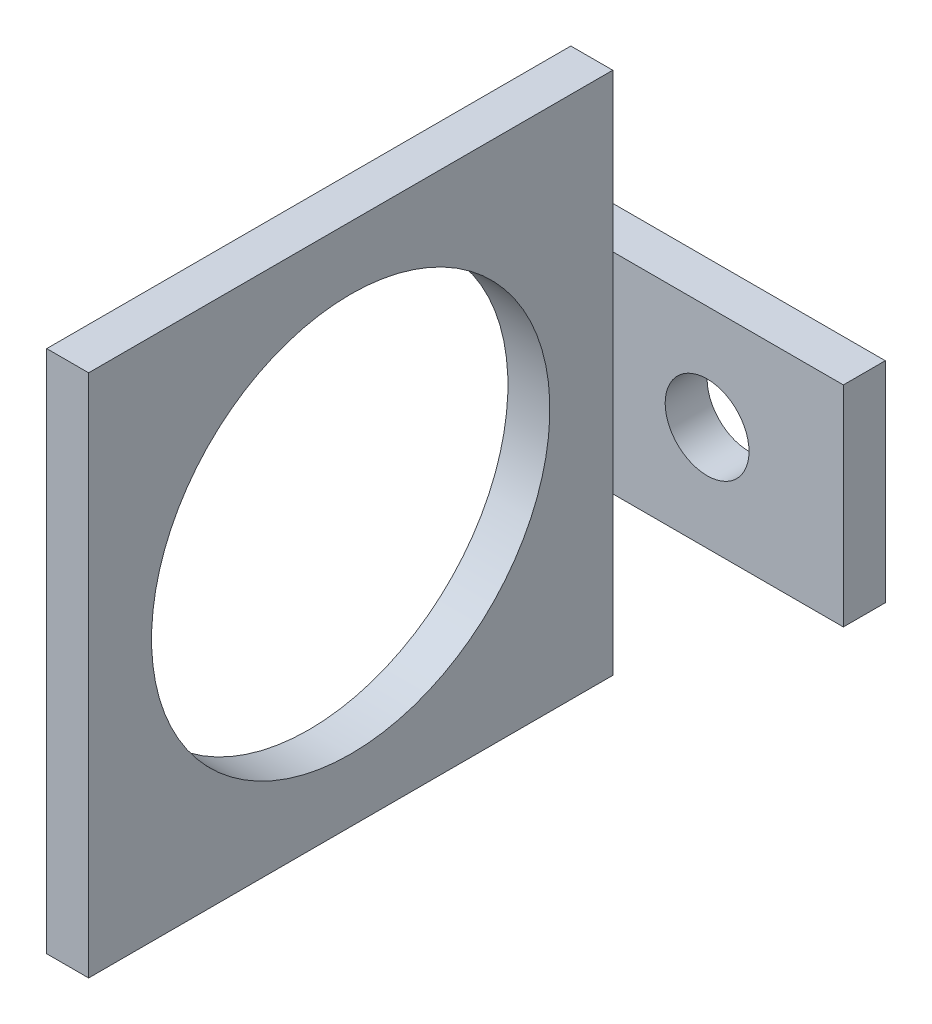
ISO-10303-21;
HEADER;
FILE_DESCRIPTION(('STEP AP214'),'2;1');
FILE_NAME('part.step','',(''),(''),'','','');
FILE_SCHEMA(('AUTOMOTIVE_DESIGN { 1 0 10303 214 1 1 1 1 }'));
ENDSEC;
DATA;
#1=APPLICATION_CONTEXT('core data for automotive mechanical design processes');
#2=APPLICATION_PROTOCOL_DEFINITION('international standard','automotive_design',2000,#1);
#3=PRODUCT_CONTEXT('',#1,'mechanical');
#4=PRODUCT('Part','Part','',(#3));
#5=PRODUCT_RELATED_PRODUCT_CATEGORY('part','',(#4));
#6=PRODUCT_DEFINITION_FORMATION('','',#4);
#7=PRODUCT_DEFINITION_CONTEXT('part definition',#1,'design');
#8=PRODUCT_DEFINITION('design','',#6,#7);
#9=PRODUCT_DEFINITION_SHAPE('','',#8);
#10=(LENGTH_UNIT() NAMED_UNIT(*) SI_UNIT(.MILLI.,.METRE.));
#11=(NAMED_UNIT(*) PLANE_ANGLE_UNIT() SI_UNIT($,.RADIAN.));
#12=(NAMED_UNIT(*) SI_UNIT($,.STERADIAN.) SOLID_ANGLE_UNIT());
#13=UNCERTAINTY_MEASURE_WITH_UNIT(LENGTH_MEASURE(1.E-05),#10,'distance_accuracy_value','');
#14=(GEOMETRIC_REPRESENTATION_CONTEXT(3) GLOBAL_UNCERTAINTY_ASSIGNED_CONTEXT((#13)) GLOBAL_UNIT_ASSIGNED_CONTEXT((#10,
#11,#12)) REPRESENTATION_CONTEXT('',''));
#15=CARTESIAN_POINT('',(0.,0.,0.));
#16=DIRECTION('',(0.,0.,1.));
#17=DIRECTION('',(1.,0.,0.));
#18=AXIS2_PLACEMENT_3D('',#15,#16,#17);
#19=CARTESIAN_POINT('',(-6.5,-5.,2.));
#20=DIRECTION('',(0.,1.,0.));
#21=DIRECTION('',(0.,0.,1.));
#22=AXIS2_PLACEMENT_3D('',#19,#20,#21);
#23=PLANE('',#22);
#24=DIRECTION('',(1.,0.,0.));
#25=VECTOR('',#24,1.);
#26=CARTESIAN_POINT('',(-6.49999999999999,-5.,2.));
#27=LINE('',#26,#25);
#28=CARTESIAN_POINT('',(-6.5,-5.,2.));
#29=VERTEX_POINT('',#28);
#30=CARTESIAN_POINT('',(-4.5,-5.,2.));
#31=VERTEX_POINT('',#30);
#32=EDGE_CURVE('E51',#29,#31,#27,.T.);
#33=ORIENTED_EDGE('',*,*,#32,.F.);
#34=DIRECTION('',(0.,0.,-1.));
#35=VECTOR('',#34,1.);
#36=CARTESIAN_POINT('',(-6.5,-5.,2.));
#37=LINE('',#36,#35);
#38=CARTESIAN_POINT('',(-6.5,-5.,0.));
#39=VERTEX_POINT('',#38);
#40=EDGE_CURVE('E80',#29,#39,#37,.T.);
#41=ORIENTED_EDGE('',*,*,#40,.T.);
#42=DIRECTION('',(1.,0.,0.));
#43=VECTOR('',#42,1.);
#44=CARTESIAN_POINT('',(-6.5,-5.,0.));
#45=LINE('',#44,#43);
#46=CARTESIAN_POINT('',(6.5,-5.,0.));
#47=VERTEX_POINT('',#46);
#48=EDGE_CURVE('E76',#39,#47,#45,.T.);
#49=ORIENTED_EDGE('',*,*,#48,.T.);
#50=DIRECTION('',(0.,0.,-1.));
#51=VECTOR('',#50,1.);
#52=CARTESIAN_POINT('',(6.5,-5.,2.));
#53=LINE('',#52,#51);
#54=CARTESIAN_POINT('',(6.5,-5.,2.));
#55=VERTEX_POINT('',#54);
#56=EDGE_CURVE('E78',#55,#47,#53,.T.);
#57=ORIENTED_EDGE('',*,*,#56,.F.);
#58=DIRECTION('',(1.,0.,0.));
#59=VECTOR('',#58,1.);
#60=CARTESIAN_POINT('',(-6.5,-5.,2.));
#61=LINE('',#60,#59);
#62=EDGE_CURVE('E59',#31,#55,#61,.T.);
#63=ORIENTED_EDGE('',*,*,#62,.F.);
#64=EDGE_LOOP('',(#33,#41,#49,#57,#63));
#65=FACE_BOUND('',#64,.T.);
#66=ADVANCED_FACE('F36',(#65),#23,.F.);
#67=CARTESIAN_POINT('',(-6.5,5.,2.));
#68=DIRECTION('',(0.,-1.,0.));
#69=DIRECTION('',(0.,0.,-1.));
#70=AXIS2_PLACEMENT_3D('',#67,#68,#69);
#71=PLANE('',#70);
#72=DIRECTION('',(-1.,0.,0.));
#73=VECTOR('',#72,1.);
#74=CARTESIAN_POINT('',(-6.5,5.,2.));
#75=LINE('',#74,#73);
#76=CARTESIAN_POINT('',(-4.5,5.,2.));
#77=VERTEX_POINT('',#76);
#78=CARTESIAN_POINT('',(-6.5,5.,2.));
#79=VERTEX_POINT('',#78);
#80=EDGE_CURVE('E120',#77,#79,#75,.T.);
#81=ORIENTED_EDGE('',*,*,#80,.F.);
#82=DIRECTION('',(-1.,0.,0.));
#83=VECTOR('',#82,1.);
#84=CARTESIAN_POINT('',(-6.5,5.,2.));
#85=LINE('',#84,#83);
#86=CARTESIAN_POINT('',(6.5,5.,2.));
#87=VERTEX_POINT('',#86);
#88=EDGE_CURVE('E119',#87,#77,#85,.T.);
#89=ORIENTED_EDGE('',*,*,#88,.F.);
#90=DIRECTION('',(0.,0.,-1.));
#91=VECTOR('',#90,1.);
#92=CARTESIAN_POINT('',(6.5,5.,2.));
#93=LINE('',#92,#91);
#94=CARTESIAN_POINT('',(6.5,5.,0.));
#95=VERTEX_POINT('',#94);
#96=EDGE_CURVE('E11',#87,#95,#93,.T.);
#97=ORIENTED_EDGE('',*,*,#96,.T.);
#98=DIRECTION('',(-1.,0.,0.));
#99=VECTOR('',#98,1.);
#100=CARTESIAN_POINT('',(-6.5,5.,0.));
#101=LINE('',#100,#99);
#102=CARTESIAN_POINT('',(-6.5,5.,0.));
#103=VERTEX_POINT('',#102);
#104=EDGE_CURVE('E95',#95,#103,#101,.T.);
#105=ORIENTED_EDGE('',*,*,#104,.T.);
#106=DIRECTION('',(0.,0.,-1.));
#107=VECTOR('',#106,1.);
#108=CARTESIAN_POINT('',(-6.5,5.,2.));
#109=LINE('',#108,#107);
#110=EDGE_CURVE('E44',#79,#103,#109,.T.);
#111=ORIENTED_EDGE('',*,*,#110,.F.);
#112=EDGE_LOOP('',(#81,#89,#97,#105,#111));
#113=FACE_BOUND('',#112,.T.);
#114=ADVANCED_FACE('F117',(#113),#71,.F.);
#115=CARTESIAN_POINT('',(6.5,5.,2.));
#116=DIRECTION('',(-1.,0.,0.));
#117=DIRECTION('',(0.,-1.,0.));
#118=AXIS2_PLACEMENT_3D('',#115,#116,#117);
#119=PLANE('',#118);
#120=DIRECTION('',(0.,1.,0.));
#121=VECTOR('',#120,1.);
#122=CARTESIAN_POINT('',(6.5,5.,0.));
#123=LINE('',#122,#121);
#124=EDGE_CURVE('E91',#47,#95,#123,.T.);
#125=ORIENTED_EDGE('',*,*,#124,.T.);
#126=ORIENTED_EDGE('',*,*,#96,.F.);
#127=DIRECTION('',(0.,1.,0.));
#128=VECTOR('',#127,1.);
#129=CARTESIAN_POINT('',(6.5,5.,2.));
#130=LINE('',#129,#128);
#131=EDGE_CURVE('E85',#55,#87,#130,.T.);
#132=ORIENTED_EDGE('',*,*,#131,.F.);
#133=ORIENTED_EDGE('',*,*,#56,.T.);
#134=EDGE_LOOP('',(#125,#126,#132,#133));
#135=FACE_BOUND('',#134,.T.);
#136=ADVANCED_FACE('F38',(#135),#119,.F.);
#137=CARTESIAN_POINT('',(-6.5,5.,2.));
#138=DIRECTION('',(1.,0.,0.));
#139=DIRECTION('',(0.,0.,-1.));
#140=AXIS2_PLACEMENT_3D('',#137,#138,#139);
#141=PLANE('',#140);
#142=CARTESIAN_POINT('',(-6.5,0.,14.5));
#143=DIRECTION('',(1.,0.,0.));
#144=DIRECTION('',(0.,1.,0.));
#145=AXIS2_PLACEMENT_3D('',#142,#143,#144);
#146=CIRCLE('',#145,9.5);
#147=CARTESIAN_POINT('',(-6.5,9.5,14.5));
#148=VERTEX_POINT('',#147);
#149=EDGE_CURVE('E171',#148,#148,#146,.T.);
#150=ORIENTED_EDGE('',*,*,#149,.T.);
#151=EDGE_LOOP('',(#150));
#152=FACE_BOUND('',#151,.T.);
#153=DIRECTION('',(0.,-1.,0.));
#154=VECTOR('',#153,1.);
#155=CARTESIAN_POINT('',(-6.5,5.,0.));
#156=LINE('',#155,#154);
#157=EDGE_CURVE('E86',#103,#39,#156,.T.);
#158=ORIENTED_EDGE('',*,*,#157,.T.);
#159=ORIENTED_EDGE('',*,*,#40,.F.);
#160=DIRECTION('',(0.,1.,0.));
#161=VECTOR('',#160,1.);
#162=CARTESIAN_POINT('',(-6.49999999999999,-12.5,2.));
#163=LINE('',#162,#161);
#164=CARTESIAN_POINT('',(-6.49999999999999,-12.5,2.));
#165=VERTEX_POINT('',#164);
#166=EDGE_CURVE('E136',#165,#29,#163,.T.);
#167=ORIENTED_EDGE('',*,*,#166,.F.);
#168=DIRECTION('',(0.,0.,-1.));
#169=VECTOR('',#168,1.);
#170=CARTESIAN_POINT('',(-6.5,-12.5,27.));
#171=LINE('',#170,#169);
#172=CARTESIAN_POINT('',(-6.5,-12.5,27.));
#173=VERTEX_POINT('',#172);
#174=EDGE_CURVE('E154',#173,#165,#171,.T.);
#175=ORIENTED_EDGE('',*,*,#174,.F.);
#176=DIRECTION('',(0.,-1.,0.));
#177=VECTOR('',#176,1.);
#178=CARTESIAN_POINT('',(-6.5,5.,27.));
#179=LINE('',#178,#177);
#180=CARTESIAN_POINT('',(-6.5,12.5,27.));
#181=VERTEX_POINT('',#180);
#182=EDGE_CURVE('E100',#181,#173,#179,.T.);
#183=ORIENTED_EDGE('',*,*,#182,.F.);
#184=DIRECTION('',(0.,0.,1.));
#185=VECTOR('',#184,1.);
#186=CARTESIAN_POINT('',(-6.5,12.5,27.));
#187=LINE('',#186,#185);
#188=CARTESIAN_POINT('',(-6.5,12.5,2.));
#189=VERTEX_POINT('',#188);
#190=EDGE_CURVE('E135',#189,#181,#187,.T.);
#191=ORIENTED_EDGE('',*,*,#190,.F.);
#192=DIRECTION('',(0.,-1.,0.));
#193=VECTOR('',#192,1.);
#194=CARTESIAN_POINT('',(-6.5,12.5,2.));
#195=LINE('',#194,#193);
#196=EDGE_CURVE('E113',#189,#79,#195,.T.);
#197=ORIENTED_EDGE('',*,*,#196,.T.);
#198=ORIENTED_EDGE('',*,*,#110,.T.);
#199=EDGE_LOOP('',(#158,#159,#167,#175,#183,#191,#197,#198));
#200=FACE_BOUND('',#199,.T.);
#201=ADVANCED_FACE('F109',(#152,#200),#141,.F.);
#202=CARTESIAN_POINT('',(0.,0.,2.));
#203=DIRECTION('',(0.,0.,1.));
#204=DIRECTION('',(1.,0.,0.));
#205=AXIS2_PLACEMENT_3D('',#202,#203,#204);
#206=PLANE('',#205);
#207=CARTESIAN_POINT('',(0.,0.,2.));
#208=DIRECTION('',(0.,0.,1.));
#209=DIRECTION('',(1.,0.,0.));
#210=AXIS2_PLACEMENT_3D('',#207,#208,#209);
#211=CIRCLE('',#210,2.);
#212=CARTESIAN_POINT('',(2.,0.,2.));
#213=VERTEX_POINT('',#212);
#214=EDGE_CURVE('E155',#213,#213,#211,.T.);
#215=ORIENTED_EDGE('',*,*,#214,.F.);
#216=EDGE_LOOP('',(#215));
#217=FACE_BOUND('',#216,.T.);
#218=DIRECTION('',(0.,1.,0.));
#219=VECTOR('',#218,1.);
#220=CARTESIAN_POINT('',(-4.5,5.,2.));
#221=LINE('',#220,#219);
#222=EDGE_CURVE('E125',#31,#77,#221,.T.);
#223=ORIENTED_EDGE('',*,*,#222,.F.);
#224=ORIENTED_EDGE('',*,*,#62,.T.);
#225=ORIENTED_EDGE('',*,*,#131,.T.);
#226=ORIENTED_EDGE('',*,*,#88,.T.);
#227=EDGE_LOOP('',(#223,#224,#225,#226));
#228=FACE_BOUND('',#227,.T.);
#229=ADVANCED_FACE('F122',(#217,#228),#206,.T.);
#230=CARTESIAN_POINT('',(0.,0.,0.));
#231=DIRECTION('',(0.,0.,1.));
#232=DIRECTION('',(1.,0.,0.));
#233=AXIS2_PLACEMENT_3D('',#230,#231,#232);
#234=PLANE('',#233);
#235=CARTESIAN_POINT('',(0.,0.,0.));
#236=DIRECTION('',(0.,0.,-1.));
#237=DIRECTION('',(-1.,0.,0.));
#238=AXIS2_PLACEMENT_3D('',#235,#236,#237);
#239=CIRCLE('',#238,2.);
#240=CARTESIAN_POINT('',(-2.,0.,0.));
#241=VERTEX_POINT('',#240);
#242=EDGE_CURVE('E168',#241,#241,#239,.T.);
#243=ORIENTED_EDGE('',*,*,#242,.F.);
#244=EDGE_LOOP('',(#243));
#245=FACE_BOUND('',#244,.T.);
#246=ORIENTED_EDGE('',*,*,#124,.F.);
#247=ORIENTED_EDGE('',*,*,#48,.F.);
#248=ORIENTED_EDGE('',*,*,#157,.F.);
#249=ORIENTED_EDGE('',*,*,#104,.F.);
#250=EDGE_LOOP('',(#246,#247,#248,#249));
#251=FACE_BOUND('',#250,.T.);
#252=ADVANCED_FACE('F93',(#245,#251),#234,.F.);
#253=CARTESIAN_POINT('',(-4.5,5.,27.));
#254=DIRECTION('',(-1.,0.,0.));
#255=DIRECTION('',(0.,-1.,0.));
#256=AXIS2_PLACEMENT_3D('',#253,#254,#255);
#257=PLANE('',#256);
#258=CARTESIAN_POINT('',(-4.5,0.,14.5));
#259=DIRECTION('',(1.,0.,0.));
#260=DIRECTION('',(0.,1.,0.));
#261=AXIS2_PLACEMENT_3D('',#258,#259,#260);
#262=CIRCLE('',#261,9.5);
#263=CARTESIAN_POINT('',(-4.5,9.5,14.5));
#264=VERTEX_POINT('',#263);
#265=EDGE_CURVE('E172',#264,#264,#262,.T.);
#266=ORIENTED_EDGE('',*,*,#265,.F.);
#267=EDGE_LOOP('',(#266));
#268=FACE_BOUND('',#267,.T.);
#269=ORIENTED_EDGE('',*,*,#222,.T.);
#270=DIRECTION('',(0.,-1.,0.));
#271=VECTOR('',#270,1.);
#272=CARTESIAN_POINT('',(-4.5,12.5,2.));
#273=LINE('',#272,#271);
#274=CARTESIAN_POINT('',(-4.5,12.5,2.));
#275=VERTEX_POINT('',#274);
#276=EDGE_CURVE('E126',#275,#77,#273,.T.);
#277=ORIENTED_EDGE('',*,*,#276,.F.);
#278=DIRECTION('',(0.,0.,-1.));
#279=VECTOR('',#278,1.);
#280=CARTESIAN_POINT('',(-4.5,12.5,27.));
#281=LINE('',#280,#279);
#282=CARTESIAN_POINT('',(-4.5,12.5,27.));
#283=VERTEX_POINT('',#282);
#284=EDGE_CURVE('E139',#283,#275,#281,.T.);
#285=ORIENTED_EDGE('',*,*,#284,.F.);
#286=DIRECTION('',(0.,1.,0.));
#287=VECTOR('',#286,1.);
#288=CARTESIAN_POINT('',(-4.5,5.,27.));
#289=LINE('',#288,#287);
#290=CARTESIAN_POINT('',(-4.5,-12.5,27.));
#291=VERTEX_POINT('',#290);
#292=EDGE_CURVE('E96',#291,#283,#289,.T.);
#293=ORIENTED_EDGE('',*,*,#292,.F.);
#294=DIRECTION('',(0.,0.,1.));
#295=VECTOR('',#294,1.);
#296=CARTESIAN_POINT('',(-4.5,-12.5,27.));
#297=LINE('',#296,#295);
#298=CARTESIAN_POINT('',(-4.5,-12.5,2.));
#299=VERTEX_POINT('',#298);
#300=EDGE_CURVE('E158',#299,#291,#297,.T.);
#301=ORIENTED_EDGE('',*,*,#300,.F.);
#302=DIRECTION('',(0.,1.,0.));
#303=VECTOR('',#302,1.);
#304=CARTESIAN_POINT('',(-4.5,-12.5,2.));
#305=LINE('',#304,#303);
#306=EDGE_CURVE('E149',#299,#31,#305,.T.);
#307=ORIENTED_EDGE('',*,*,#306,.T.);
#308=EDGE_LOOP('',(#269,#277,#285,#293,#301,#307));
#309=FACE_BOUND('',#308,.T.);
#310=ADVANCED_FACE('F186',(#268,#309),#257,.F.);
#311=CARTESIAN_POINT('',(0.,0.,27.));
#312=DIRECTION('',(0.,0.,1.));
#313=DIRECTION('',(1.,0.,0.));
#314=AXIS2_PLACEMENT_3D('',#311,#312,#313);
#315=PLANE('',#314);
#316=ORIENTED_EDGE('',*,*,#182,.T.);
#317=DIRECTION('',(-1.,0.,0.));
#318=VECTOR('',#317,1.);
#319=CARTESIAN_POINT('',(-6.5,-12.5,27.));
#320=LINE('',#319,#318);
#321=EDGE_CURVE('E152',#291,#173,#320,.T.);
#322=ORIENTED_EDGE('',*,*,#321,.F.);
#323=ORIENTED_EDGE('',*,*,#292,.T.);
#324=DIRECTION('',(1.,0.,0.));
#325=VECTOR('',#324,1.);
#326=CARTESIAN_POINT('',(-6.5,12.5,27.));
#327=LINE('',#326,#325);
#328=EDGE_CURVE('E142',#181,#283,#327,.T.);
#329=ORIENTED_EDGE('',*,*,#328,.F.);
#330=EDGE_LOOP('',(#316,#322,#323,#329));
#331=FACE_BOUND('',#330,.T.);
#332=ADVANCED_FACE('F189',(#331),#315,.T.);
#333=CARTESIAN_POINT('',(-6.5,12.5,2.));
#334=DIRECTION('',(0.,0.,1.));
#335=DIRECTION('',(1.,0.,0.));
#336=AXIS2_PLACEMENT_3D('',#333,#334,#335);
#337=PLANE('',#336);
#338=ORIENTED_EDGE('',*,*,#80,.T.);
#339=ORIENTED_EDGE('',*,*,#196,.F.);
#340=DIRECTION('',(-1.,0.,0.));
#341=VECTOR('',#340,1.);
#342=CARTESIAN_POINT('',(-6.5,12.5,2.));
#343=LINE('',#342,#341);
#344=EDGE_CURVE('E133',#275,#189,#343,.T.);
#345=ORIENTED_EDGE('',*,*,#344,.F.);
#346=ORIENTED_EDGE('',*,*,#276,.T.);
#347=EDGE_LOOP('',(#338,#339,#345,#346));
#348=FACE_BOUND('',#347,.T.);
#349=ADVANCED_FACE('F200',(#348),#337,.F.);
#350=CARTESIAN_POINT('',(0.,12.5,0.));
#351=DIRECTION('',(0.,-1.,0.));
#352=DIRECTION('',(0.,0.,-1.));
#353=AXIS2_PLACEMENT_3D('',#350,#351,#352);
#354=PLANE('',#353);
#355=ORIENTED_EDGE('',*,*,#190,.T.);
#356=ORIENTED_EDGE('',*,*,#328,.T.);
#357=ORIENTED_EDGE('',*,*,#284,.T.);
#358=ORIENTED_EDGE('',*,*,#344,.T.);
#359=EDGE_LOOP('',(#355,#356,#357,#358));
#360=FACE_BOUND('',#359,.T.);
#361=ADVANCED_FACE('F204',(#360),#354,.F.);
#362=CARTESIAN_POINT('',(-6.49999999999999,-12.5,2.));
#363=DIRECTION('',(0.,0.,1.));
#364=DIRECTION('',(1.,0.,0.));
#365=AXIS2_PLACEMENT_3D('',#362,#363,#364);
#366=PLANE('',#365);
#367=ORIENTED_EDGE('',*,*,#32,.T.);
#368=ORIENTED_EDGE('',*,*,#306,.F.);
#369=DIRECTION('',(1.,0.,0.));
#370=VECTOR('',#369,1.);
#371=CARTESIAN_POINT('',(-6.49999999999999,-12.5,2.));
#372=LINE('',#371,#370);
#373=EDGE_CURVE('E161',#165,#299,#372,.T.);
#374=ORIENTED_EDGE('',*,*,#373,.F.);
#375=ORIENTED_EDGE('',*,*,#166,.T.);
#376=EDGE_LOOP('',(#367,#368,#374,#375));
#377=FACE_BOUND('',#376,.T.);
#378=ADVANCED_FACE('F229',(#377),#366,.F.);
#379=CARTESIAN_POINT('',(0.,-12.5,0.));
#380=DIRECTION('',(0.,-1.,0.));
#381=DIRECTION('',(0.,0.,-1.));
#382=AXIS2_PLACEMENT_3D('',#379,#380,#381);
#383=PLANE('',#382);
#384=ORIENTED_EDGE('',*,*,#174,.T.);
#385=ORIENTED_EDGE('',*,*,#373,.T.);
#386=ORIENTED_EDGE('',*,*,#300,.T.);
#387=ORIENTED_EDGE('',*,*,#321,.T.);
#388=EDGE_LOOP('',(#384,#385,#386,#387));
#389=FACE_BOUND('',#388,.T.);
#390=ADVANCED_FACE('F224',(#389),#383,.T.);
#391=CARTESIAN_POINT('',(0.,0.,7.5));
#392=DIRECTION('',(0.,0.,-1.));
#393=DIRECTION('',(-1.,0.,0.));
#394=AXIS2_PLACEMENT_3D('',#391,#392,#393);
#395=CYLINDRICAL_SURFACE('',#394,2.);
#396=ORIENTED_EDGE('',*,*,#214,.T.);
#397=EDGE_LOOP('',(#396));
#398=FACE_BOUND('',#397,.T.);
#399=ORIENTED_EDGE('',*,*,#242,.T.);
#400=EDGE_LOOP('',(#399));
#401=FACE_BOUND('',#400,.T.);
#402=ADVANCED_FACE('F182',(#398,#401),#395,.F.);
#403=CARTESIAN_POINT('',(-6.5,0.,14.5));
#404=DIRECTION('',(1.,0.,0.));
#405=DIRECTION('',(0.,1.,0.));
#406=AXIS2_PLACEMENT_3D('',#403,#404,#405);
#407=CYLINDRICAL_SURFACE('',#406,9.5);
#408=ORIENTED_EDGE('',*,*,#149,.F.);
#409=EDGE_LOOP('',(#408));
#410=FACE_BOUND('',#409,.T.);
#411=ORIENTED_EDGE('',*,*,#265,.T.);
#412=EDGE_LOOP('',(#411));
#413=FACE_BOUND('',#412,.T.);
#414=ADVANCED_FACE('F179',(#410,#413),#407,.F.);
#415=CLOSED_SHELL('',(#66,#114,#136,#201,#229,#252,#310,#332,#349,#361,#378,#390,#402,#414));
#416=MANIFOLD_SOLID_BREP('B2',#415);
#417=ADVANCED_BREP_SHAPE_REPRESENTATION('',(#18,#416),#14);
#418=SHAPE_DEFINITION_REPRESENTATION(#9,#417);
ENDSEC;
END-ISO-10303-21;
